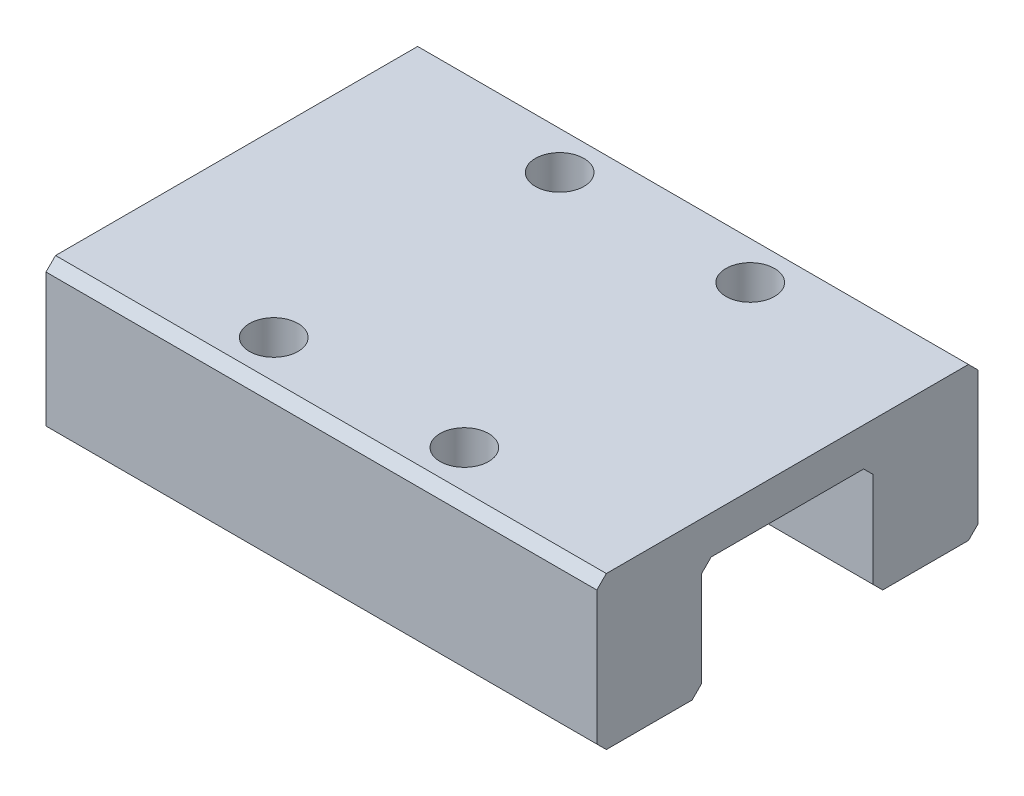
ISO-10303-21;
HEADER;
FILE_DESCRIPTION(('STEP AP214'),'2;1');
FILE_NAME('part.step','',(''),(''),'','','');
FILE_SCHEMA(('AUTOMOTIVE_DESIGN { 1 0 10303 214 1 1 1 1 }'));
ENDSEC;
DATA;
#1=APPLICATION_CONTEXT('core data for automotive mechanical design processes');
#2=APPLICATION_PROTOCOL_DEFINITION('international standard','automotive_design',2000,#1);
#3=PRODUCT_CONTEXT('',#1,'mechanical');
#4=PRODUCT('Part','Part','',(#3));
#5=PRODUCT_RELATED_PRODUCT_CATEGORY('part','',(#4));
#6=PRODUCT_DEFINITION_FORMATION('','',#4);
#7=PRODUCT_DEFINITION_CONTEXT('part definition',#1,'design');
#8=PRODUCT_DEFINITION('design','',#6,#7);
#9=PRODUCT_DEFINITION_SHAPE('','',#8);
#10=(LENGTH_UNIT() NAMED_UNIT(*) SI_UNIT(.MILLI.,.METRE.));
#11=(NAMED_UNIT(*) PLANE_ANGLE_UNIT() SI_UNIT($,.RADIAN.));
#12=(NAMED_UNIT(*) SI_UNIT($,.STERADIAN.) SOLID_ANGLE_UNIT());
#13=UNCERTAINTY_MEASURE_WITH_UNIT(LENGTH_MEASURE(1.E-05),#10,'distance_accuracy_value','');
#14=(GEOMETRIC_REPRESENTATION_CONTEXT(3) GLOBAL_UNCERTAINTY_ASSIGNED_CONTEXT((#13)) GLOBAL_UNIT_ASSIGNED_CONTEXT((#10,
#11,#12)) REPRESENTATION_CONTEXT('',''));
#15=CARTESIAN_POINT('',(0.,0.,0.));
#16=DIRECTION('',(0.,0.,1.));
#17=DIRECTION('',(1.,0.,0.));
#18=AXIS2_PLACEMENT_3D('',#15,#16,#17);
#19=CARTESIAN_POINT('',(28.9,-5.99999999999997,4.50000000000001));
#20=DIRECTION('',(0.,1.,0.));
#21=DIRECTION('',(0.,0.,1.));
#22=AXIS2_PLACEMENT_3D('',#19,#20,#21);
#23=PLANE('',#22);
#24=DIRECTION('',(0.,0.,-1.));
#25=VECTOR('',#24,1.);
#26=CARTESIAN_POINT('',(28.9,-5.99999999999997,4.50000000000001));
#27=LINE('',#26,#25);
#28=CARTESIAN_POINT('',(28.9,-5.99999999999998,9.50000000000001));
#29=VERTEX_POINT('',#28);
#30=CARTESIAN_POINT('',(28.9,-5.99999999999997,5.00000000000001));
#31=VERTEX_POINT('',#30);
#32=EDGE_CURVE('E217',#29,#31,#27,.T.);
#33=ORIENTED_EDGE('',*,*,#32,.F.);
#34=DIRECTION('',(-1.,0.,0.));
#35=VECTOR('',#34,1.);
#36=CARTESIAN_POINT('',(28.9,-5.99999999999998,9.50000000000001));
#37=LINE('',#36,#35);
#38=CARTESIAN_POINT('',(0.,-5.99999999999998,9.50000000000001));
#39=VERTEX_POINT('',#38);
#40=EDGE_CURVE('E278',#29,#39,#37,.T.);
#41=ORIENTED_EDGE('',*,*,#40,.T.);
#42=DIRECTION('',(0.,0.,-1.));
#43=VECTOR('',#42,1.);
#44=CARTESIAN_POINT('',(0.,-5.99999999999997,4.50000000000001));
#45=LINE('',#44,#43);
#46=CARTESIAN_POINT('',(0.,-5.99999999999997,5.00000000000001));
#47=VERTEX_POINT('',#46);
#48=EDGE_CURVE('E199',#39,#47,#45,.T.);
#49=ORIENTED_EDGE('',*,*,#48,.T.);
#50=DIRECTION('',(1.,0.,0.));
#51=VECTOR('',#50,1.);
#52=CARTESIAN_POINT('',(28.9,-5.99999999999997,5.00000000000001));
#53=LINE('',#52,#51);
#54=EDGE_CURVE('E275',#47,#31,#53,.T.);
#55=ORIENTED_EDGE('',*,*,#54,.T.);
#56=EDGE_LOOP('',(#33,#41,#49,#55));
#57=FACE_BOUND('',#56,.T.);
#58=ADVANCED_FACE('F46',(#57),#23,.F.);
#59=CARTESIAN_POINT('',(28.9,0.,4.50000000000001));
#60=DIRECTION('',(0.,0.,1.));
#61=DIRECTION('',(1.,0.,0.));
#62=AXIS2_PLACEMENT_3D('',#59,#60,#61);
#63=PLANE('',#62);
#64=DIRECTION('',(0.,1.,0.));
#65=VECTOR('',#64,1.);
#66=CARTESIAN_POINT('',(0.,0.,4.50000000000001));
#67=LINE('',#66,#65);
#68=CARTESIAN_POINT('',(0.,-5.49999999999997,4.50000000000001));
#69=VERTEX_POINT('',#68);
#70=CARTESIAN_POINT('',(0.,-0.499999999999971,4.50000000000001));
#71=VERTEX_POINT('',#70);
#72=EDGE_CURVE('E192',#69,#71,#67,.T.);
#73=ORIENTED_EDGE('',*,*,#72,.T.);
#74=DIRECTION('',(1.,0.,0.));
#75=VECTOR('',#74,1.);
#76=CARTESIAN_POINT('',(28.9,-0.499999999999971,4.50000000000001));
#77=LINE('',#76,#75);
#78=CARTESIAN_POINT('',(28.9,-0.499999999999971,4.50000000000001));
#79=VERTEX_POINT('',#78);
#80=EDGE_CURVE('E166',#71,#79,#77,.T.);
#81=ORIENTED_EDGE('',*,*,#80,.T.);
#82=DIRECTION('',(0.,1.,0.));
#83=VECTOR('',#82,1.);
#84=CARTESIAN_POINT('',(28.9,0.,4.50000000000001));
#85=LINE('',#84,#83);
#86=CARTESIAN_POINT('',(28.9,-5.49999999999997,4.50000000000001));
#87=VERTEX_POINT('',#86);
#88=EDGE_CURVE('E322',#87,#79,#85,.T.);
#89=ORIENTED_EDGE('',*,*,#88,.F.);
#90=DIRECTION('',(-1.,0.,0.));
#91=VECTOR('',#90,1.);
#92=CARTESIAN_POINT('',(28.9,-5.49999999999997,4.50000000000001));
#93=LINE('',#92,#91);
#94=EDGE_CURVE('E184',#87,#69,#93,.T.);
#95=ORIENTED_EDGE('',*,*,#94,.T.);
#96=EDGE_LOOP('',(#73,#81,#89,#95));
#97=FACE_BOUND('',#96,.T.);
#98=ADVANCED_FACE('F428',(#97),#63,.F.);
#99=CARTESIAN_POINT('',(28.9,0.,4.50000000000001));
#100=DIRECTION('',(0.,1.,0.));
#101=DIRECTION('',(0.,0.,1.));
#102=AXIS2_PLACEMENT_3D('',#99,#100,#101);
#103=PLANE('',#102);
#104=DIRECTION('',(0.,0.,-1.));
#105=VECTOR('',#104,1.);
#106=CARTESIAN_POINT('',(28.9,0.,4.50000000000001));
#107=LINE('',#106,#105);
#108=CARTESIAN_POINT('',(28.9,0.,4.00000000000001));
#109=VERTEX_POINT('',#108);
#110=CARTESIAN_POINT('',(28.9,0.,-4.00000000000001));
#111=VERTEX_POINT('',#110);
#112=EDGE_CURVE('E182',#109,#111,#107,.T.);
#113=ORIENTED_EDGE('',*,*,#112,.F.);
#114=DIRECTION('',(-1.,0.,0.));
#115=VECTOR('',#114,1.);
#116=CARTESIAN_POINT('',(0.,0.,4.00000000000001));
#117=LINE('',#116,#115);
#118=CARTESIAN_POINT('',(0.,0.,4.00000000000001));
#119=VERTEX_POINT('',#118);
#120=EDGE_CURVE('E165',#109,#119,#117,.T.);
#121=ORIENTED_EDGE('',*,*,#120,.T.);
#122=DIRECTION('',(0.,0.,-1.));
#123=VECTOR('',#122,1.);
#124=CARTESIAN_POINT('',(0.,0.,4.50000000000001));
#125=LINE('',#124,#123);
#126=CARTESIAN_POINT('',(0.,0.,-4.00000000000001));
#127=VERTEX_POINT('',#126);
#128=EDGE_CURVE('E179',#119,#127,#125,.T.);
#129=ORIENTED_EDGE('',*,*,#128,.T.);
#130=DIRECTION('',(1.,0.,0.));
#131=VECTOR('',#130,1.);
#132=CARTESIAN_POINT('',(28.9,0.,-4.00000000000001));
#133=LINE('',#132,#131);
#134=EDGE_CURVE('E185',#127,#111,#133,.T.);
#135=ORIENTED_EDGE('',*,*,#134,.T.);
#136=EDGE_LOOP('',(#113,#121,#129,#135));
#137=FACE_BOUND('',#136,.T.);
#138=ADVANCED_FACE('F178',(#137),#103,.F.);
#139=CARTESIAN_POINT('',(28.9,0.,-4.50000000000001));
#140=DIRECTION('',(0.,0.,-1.));
#141=DIRECTION('',(-1.,0.,0.));
#142=AXIS2_PLACEMENT_3D('',#139,#140,#141);
#143=PLANE('',#142);
#144=DIRECTION('',(0.,-1.,0.));
#145=VECTOR('',#144,1.);
#146=CARTESIAN_POINT('',(0.,0.,-4.50000000000001));
#147=LINE('',#146,#145);
#148=CARTESIAN_POINT('',(0.,-0.500000000000006,-4.50000000000001));
#149=VERTEX_POINT('',#148);
#150=CARTESIAN_POINT('',(0.,-5.5,-4.50000000000001));
#151=VERTEX_POINT('',#150);
#152=EDGE_CURVE('E191',#149,#151,#147,.T.);
#153=ORIENTED_EDGE('',*,*,#152,.T.);
#154=DIRECTION('',(1.,0.,0.));
#155=VECTOR('',#154,1.);
#156=CARTESIAN_POINT('',(28.9,-5.5,-4.50000000000001));
#157=LINE('',#156,#155);
#158=CARTESIAN_POINT('',(28.9,-5.5,-4.50000000000001));
#159=VERTEX_POINT('',#158);
#160=EDGE_CURVE('E255',#151,#159,#157,.T.);
#161=ORIENTED_EDGE('',*,*,#160,.T.);
#162=DIRECTION('',(0.,-1.,0.));
#163=VECTOR('',#162,1.);
#164=CARTESIAN_POINT('',(28.9,0.,-4.50000000000001));
#165=LINE('',#164,#163);
#166=CARTESIAN_POINT('',(28.9,-0.500000000000006,-4.50000000000001));
#167=VERTEX_POINT('',#166);
#168=EDGE_CURVE('E316',#167,#159,#165,.T.);
#169=ORIENTED_EDGE('',*,*,#168,.F.);
#170=DIRECTION('',(-1.,0.,0.));
#171=VECTOR('',#170,1.);
#172=CARTESIAN_POINT('',(0.,-0.500000000000006,-4.50000000000001));
#173=LINE('',#172,#171);
#174=EDGE_CURVE('E251',#167,#149,#173,.T.);
#175=ORIENTED_EDGE('',*,*,#174,.T.);
#176=EDGE_LOOP('',(#153,#161,#169,#175));
#177=FACE_BOUND('',#176,.T.);
#178=ADVANCED_FACE('F418',(#177),#143,.F.);
#179=CARTESIAN_POINT('',(28.9,-6.,-4.50000000000001));
#180=DIRECTION('',(0.,1.,0.));
#181=DIRECTION('',(0.,0.,1.));
#182=AXIS2_PLACEMENT_3D('',#179,#180,#181);
#183=PLANE('',#182);
#184=DIRECTION('',(0.,0.,-1.));
#185=VECTOR('',#184,1.);
#186=CARTESIAN_POINT('',(28.9,-6.,-4.50000000000001));
#187=LINE('',#186,#185);
#188=CARTESIAN_POINT('',(28.9,-6.,-5.));
#189=VERTEX_POINT('',#188);
#190=CARTESIAN_POINT('',(28.9,-6.,-9.50000000000001));
#191=VERTEX_POINT('',#190);
#192=EDGE_CURVE('E312',#189,#191,#187,.T.);
#193=ORIENTED_EDGE('',*,*,#192,.F.);
#194=DIRECTION('',(-1.,0.,0.));
#195=VECTOR('',#194,1.);
#196=CARTESIAN_POINT('',(28.9,-6.,-5.));
#197=LINE('',#196,#195);
#198=CARTESIAN_POINT('',(0.,-6.,-5.));
#199=VERTEX_POINT('',#198);
#200=EDGE_CURVE('E229',#189,#199,#197,.T.);
#201=ORIENTED_EDGE('',*,*,#200,.T.);
#202=DIRECTION('',(0.,0.,-1.));
#203=VECTOR('',#202,1.);
#204=CARTESIAN_POINT('',(0.,-6.,-4.50000000000001));
#205=LINE('',#204,#203);
#206=CARTESIAN_POINT('',(0.,-6.,-9.50000000000001));
#207=VERTEX_POINT('',#206);
#208=EDGE_CURVE('E197',#199,#207,#205,.T.);
#209=ORIENTED_EDGE('',*,*,#208,.T.);
#210=DIRECTION('',(1.,0.,0.));
#211=VECTOR('',#210,1.);
#212=CARTESIAN_POINT('',(28.9,-6.,-9.50000000000001));
#213=LINE('',#212,#211);
#214=EDGE_CURVE('E226',#207,#191,#213,.T.);
#215=ORIENTED_EDGE('',*,*,#214,.T.);
#216=EDGE_LOOP('',(#193,#201,#209,#215));
#217=FACE_BOUND('',#216,.T.);
#218=ADVANCED_FACE('F411',(#217),#183,.F.);
#219=CARTESIAN_POINT('',(28.9,-6.00000000000001,-10.));
#220=DIRECTION('',(0.,0.,1.));
#221=DIRECTION('',(1.,0.,0.));
#222=AXIS2_PLACEMENT_3D('',#219,#220,#221);
#223=PLANE('',#222);
#224=DIRECTION('',(0.,1.,0.));
#225=VECTOR('',#224,1.);
#226=CARTESIAN_POINT('',(28.9,-6.00000000000001,-10.));
#227=LINE('',#226,#225);
#228=CARTESIAN_POINT('',(28.9,-5.50000000000001,-10.));
#229=VERTEX_POINT('',#228);
#230=CARTESIAN_POINT('',(28.9,1.49999999999999,-10.));
#231=VERTEX_POINT('',#230);
#232=EDGE_CURVE('E308',#229,#231,#227,.T.);
#233=ORIENTED_EDGE('',*,*,#232,.F.);
#234=DIRECTION('',(-1.,0.,0.));
#235=VECTOR('',#234,1.);
#236=CARTESIAN_POINT('',(28.9,-5.50000000000001,-10.));
#237=LINE('',#236,#235);
#238=CARTESIAN_POINT('',(0.,-5.50000000000001,-10.));
#239=VERTEX_POINT('',#238);
#240=EDGE_CURVE('E291',#229,#239,#237,.T.);
#241=ORIENTED_EDGE('',*,*,#240,.T.);
#242=DIRECTION('',(0.,1.,0.));
#243=VECTOR('',#242,1.);
#244=CARTESIAN_POINT('',(0.,-6.00000000000001,-10.));
#245=LINE('',#244,#243);
#246=CARTESIAN_POINT('',(0.,1.49999999999999,-10.));
#247=VERTEX_POINT('',#246);
#248=EDGE_CURVE('E206',#239,#247,#245,.T.);
#249=ORIENTED_EDGE('',*,*,#248,.T.);
#250=DIRECTION('',(1.,0.,0.));
#251=VECTOR('',#250,1.);
#252=CARTESIAN_POINT('',(28.9,1.49999999999999,-10.));
#253=LINE('',#252,#251);
#254=EDGE_CURVE('E288',#247,#231,#253,.T.);
#255=ORIENTED_EDGE('',*,*,#254,.T.);
#256=EDGE_LOOP('',(#233,#241,#249,#255));
#257=FACE_BOUND('',#256,.T.);
#258=ADVANCED_FACE('F385',(#257),#223,.F.);
#259=CARTESIAN_POINT('',(28.9,2.,-10.));
#260=DIRECTION('',(0.,-1.,0.));
#261=DIRECTION('',(0.,0.,-1.));
#262=AXIS2_PLACEMENT_3D('',#259,#260,#261);
#263=PLANE('',#262);
#264=CARTESIAN_POINT('',(9.45,2.00000000000002,7.5));
#265=DIRECTION('',(0.,1.,0.));
#266=DIRECTION('',(0.,0.,-1.));
#267=AXIS2_PLACEMENT_3D('',#264,#265,#266);
#268=CIRCLE('',#267,1.275);
#269=CARTESIAN_POINT('',(9.45,2.00000000000002,6.225));
#270=VERTEX_POINT('',#269);
#271=EDGE_CURVE('E364',#270,#270,#268,.T.);
#272=ORIENTED_EDGE('',*,*,#271,.F.);
#273=EDGE_LOOP('',(#272));
#274=FACE_BOUND('',#273,.T.);
#275=CARTESIAN_POINT('',(19.45,2.00000000000002,7.5));
#276=DIRECTION('',(0.,1.,0.));
#277=DIRECTION('',(0.,0.,1.));
#278=AXIS2_PLACEMENT_3D('',#275,#276,#277);
#279=CIRCLE('',#278,1.275);
#280=CARTESIAN_POINT('',(19.45,2.00000000000002,8.775));
#281=VERTEX_POINT('',#280);
#282=EDGE_CURVE('E356',#281,#281,#279,.T.);
#283=ORIENTED_EDGE('',*,*,#282,.F.);
#284=EDGE_LOOP('',(#283));
#285=FACE_BOUND('',#284,.T.);
#286=CARTESIAN_POINT('',(19.45,2.,-7.5));
#287=DIRECTION('',(0.,1.,0.));
#288=DIRECTION('',(0.,0.,-1.));
#289=AXIS2_PLACEMENT_3D('',#286,#287,#288);
#290=CIRCLE('',#289,1.275);
#291=CARTESIAN_POINT('',(19.45,2.,-8.775));
#292=VERTEX_POINT('',#291);
#293=EDGE_CURVE('E348',#292,#292,#290,.T.);
#294=ORIENTED_EDGE('',*,*,#293,.F.);
#295=EDGE_LOOP('',(#294));
#296=FACE_BOUND('',#295,.T.);
#297=CARTESIAN_POINT('',(9.45,2.,-7.5));
#298=DIRECTION('',(0.,1.,0.));
#299=DIRECTION('',(0.,0.,1.));
#300=AXIS2_PLACEMENT_3D('',#297,#298,#299);
#301=CIRCLE('',#300,1.275);
#302=CARTESIAN_POINT('',(9.45,2.,-6.225));
#303=VERTEX_POINT('',#302);
#304=EDGE_CURVE('E332',#303,#303,#301,.T.);
#305=ORIENTED_EDGE('',*,*,#304,.F.);
#306=EDGE_LOOP('',(#305));
#307=FACE_BOUND('',#306,.T.);
#308=DIRECTION('',(0.,0.,1.));
#309=VECTOR('',#308,1.);
#310=CARTESIAN_POINT('',(28.9,2.,-10.));
#311=LINE('',#310,#309);
#312=CARTESIAN_POINT('',(28.9,2.,-9.50000000000001));
#313=VERTEX_POINT('',#312);
#314=CARTESIAN_POINT('',(28.9,2.00000000000002,9.5));
#315=VERTEX_POINT('',#314);
#316=EDGE_CURVE('E305',#313,#315,#311,.T.);
#317=ORIENTED_EDGE('',*,*,#316,.F.);
#318=DIRECTION('',(-1.,0.,0.));
#319=VECTOR('',#318,1.);
#320=CARTESIAN_POINT('',(28.9,2.,-9.50000000000001));
#321=LINE('',#320,#319);
#322=CARTESIAN_POINT('',(0.,2.,-9.50000000000001));
#323=VERTEX_POINT('',#322);
#324=EDGE_CURVE('E173',#313,#323,#321,.T.);
#325=ORIENTED_EDGE('',*,*,#324,.T.);
#326=DIRECTION('',(0.,0.,1.));
#327=VECTOR('',#326,1.);
#328=CARTESIAN_POINT('',(0.,2.,-10.));
#329=LINE('',#328,#327);
#330=CARTESIAN_POINT('',(0.,2.00000000000002,9.5));
#331=VERTEX_POINT('',#330);
#332=EDGE_CURVE('E210',#323,#331,#329,.T.);
#333=ORIENTED_EDGE('',*,*,#332,.T.);
#334=DIRECTION('',(1.,0.,0.));
#335=VECTOR('',#334,1.);
#336=CARTESIAN_POINT('',(28.9,2.00000000000002,9.5));
#337=LINE('',#336,#335);
#338=EDGE_CURVE('E295',#331,#315,#337,.T.);
#339=ORIENTED_EDGE('',*,*,#338,.T.);
#340=EDGE_LOOP('',(#317,#325,#333,#339));
#341=FACE_BOUND('',#340,.T.);
#342=ADVANCED_FACE('F381',(#274,#285,#296,#307,#341),#263,.F.);
#343=CARTESIAN_POINT('',(28.9,-5.99999999999998,10.));
#344=DIRECTION('',(0.,0.,-1.));
#345=DIRECTION('',(-1.,0.,0.));
#346=AXIS2_PLACEMENT_3D('',#343,#344,#345);
#347=PLANE('',#346);
#348=DIRECTION('',(0.,-1.,0.));
#349=VECTOR('',#348,1.);
#350=CARTESIAN_POINT('',(0.,-5.99999999999998,10.));
#351=LINE('',#350,#349);
#352=CARTESIAN_POINT('',(0.,1.50000000000002,10.));
#353=VERTEX_POINT('',#352);
#354=CARTESIAN_POINT('',(0.,-5.49999999999998,10.));
#355=VERTEX_POINT('',#354);
#356=EDGE_CURVE('E214',#353,#355,#351,.T.);
#357=ORIENTED_EDGE('',*,*,#356,.T.);
#358=DIRECTION('',(1.,0.,0.));
#359=VECTOR('',#358,1.);
#360=CARTESIAN_POINT('',(28.9,-5.49999999999998,10.));
#361=LINE('',#360,#359);
#362=CARTESIAN_POINT('',(28.9,-5.49999999999998,10.));
#363=VERTEX_POINT('',#362);
#364=EDGE_CURVE('E62',#355,#363,#361,.T.);
#365=ORIENTED_EDGE('',*,*,#364,.T.);
#366=DIRECTION('',(0.,-1.,0.));
#367=VECTOR('',#366,1.);
#368=CARTESIAN_POINT('',(28.9,-5.99999999999998,10.));
#369=LINE('',#368,#367);
#370=CARTESIAN_POINT('',(28.9,1.50000000000002,10.));
#371=VERTEX_POINT('',#370);
#372=EDGE_CURVE('E219',#371,#363,#369,.T.);
#373=ORIENTED_EDGE('',*,*,#372,.F.);
#374=DIRECTION('',(-1.,0.,0.));
#375=VECTOR('',#374,1.);
#376=CARTESIAN_POINT('',(28.9,1.50000000000002,10.));
#377=LINE('',#376,#375);
#378=EDGE_CURVE('E282',#371,#353,#377,.T.);
#379=ORIENTED_EDGE('',*,*,#378,.T.);
#380=EDGE_LOOP('',(#357,#365,#373,#379));
#381=FACE_BOUND('',#380,.T.);
#382=ADVANCED_FACE('F384',(#381),#347,.F.);
#383=CARTESIAN_POINT('',(28.9,-5.99999999999998,10.));
#384=DIRECTION('',(-1.,0.,0.));
#385=DIRECTION('',(0.,0.,1.));
#386=AXIS2_PLACEMENT_3D('',#383,#384,#385);
#387=PLANE('',#386);
#388=ORIENTED_EDGE('',*,*,#168,.T.);
#389=DIRECTION('',(0.,0.707106781186551,0.707106781186544));
#390=VECTOR('',#389,1.);
#391=CARTESIAN_POINT('',(28.9,-6.,-5.));
#392=LINE('',#391,#390);
#393=EDGE_CURVE('E272',#159,#189,#392,.F.);
#394=ORIENTED_EDGE('',*,*,#393,.T.);
#395=ORIENTED_EDGE('',*,*,#192,.T.);
#396=DIRECTION('',(0.,-0.707106781186545,0.70710678118655));
#397=VECTOR('',#396,1.);
#398=CARTESIAN_POINT('',(28.9,-5.50000000000001,-10.));
#399=LINE('',#398,#397);
#400=EDGE_CURVE('E263',#191,#229,#399,.F.);
#401=ORIENTED_EDGE('',*,*,#400,.T.);
#402=ORIENTED_EDGE('',*,*,#232,.T.);
#403=DIRECTION('',(0.,-0.70710678118655,-0.707106781186545));
#404=VECTOR('',#403,1.);
#405=CARTESIAN_POINT('',(28.9,2.,-9.50000000000001));
#406=LINE('',#405,#404);
#407=EDGE_CURVE('E260',#231,#313,#406,.F.);
#408=ORIENTED_EDGE('',*,*,#407,.T.);
#409=ORIENTED_EDGE('',*,*,#316,.T.);
#410=DIRECTION('',(0.,0.707106781186542,-0.707106781186553));
#411=VECTOR('',#410,1.);
#412=CARTESIAN_POINT('',(28.9,1.50000000000002,10.));
#413=LINE('',#412,#411);
#414=EDGE_CURVE('E69',#315,#371,#413,.F.);
#415=ORIENTED_EDGE('',*,*,#414,.T.);
#416=ORIENTED_EDGE('',*,*,#372,.T.);
#417=DIRECTION('',(0.,0.70710678118655,0.707106781186545));
#418=VECTOR('',#417,1.);
#419=CARTESIAN_POINT('',(28.9,-5.99999999999998,9.50000000000001));
#420=LINE('',#419,#418);
#421=EDGE_CURVE('E269',#363,#29,#420,.F.);
#422=ORIENTED_EDGE('',*,*,#421,.T.);
#423=ORIENTED_EDGE('',*,*,#32,.T.);
#424=DIRECTION('',(0.,-0.707106781186548,0.707106781186548));
#425=VECTOR('',#424,1.);
#426=CARTESIAN_POINT('',(28.9,-5.49999999999997,4.50000000000001));
#427=LINE('',#426,#425);
#428=EDGE_CURVE('E266',#31,#87,#427,.F.);
#429=ORIENTED_EDGE('',*,*,#428,.T.);
#430=ORIENTED_EDGE('',*,*,#88,.T.);
#431=DIRECTION('',(0.,-0.707106781186545,0.70710678118655));
#432=VECTOR('',#431,1.);
#433=CARTESIAN_POINT('',(28.9,-5.99999999999996,10.));
#434=LINE('',#433,#432);
#435=EDGE_CURVE('E172',#79,#109,#434,.F.);
#436=ORIENTED_EDGE('',*,*,#435,.T.);
#437=ORIENTED_EDGE('',*,*,#112,.T.);
#438=DIRECTION('',(0.,0.707106781186552,0.707106781186543));
#439=VECTOR('',#438,1.);
#440=CARTESIAN_POINT('',(28.9,3.99999999999998,0.));
#441=LINE('',#440,#439);
#442=EDGE_CURVE('E11',#111,#167,#441,.F.);
#443=ORIENTED_EDGE('',*,*,#442,.T.);
#444=EDGE_LOOP('',(#388,#394,#395,#401,#402,#408,#409,#415,#416,#422,#423,#429,#430,#436,#437,#443));
#445=FACE_BOUND('',#444,.T.);
#446=ADVANCED_FACE('F424',(#445),#387,.F.);
#447=CARTESIAN_POINT('',(0.,-5.99999999999998,10.));
#448=DIRECTION('',(-1.,0.,0.));
#449=DIRECTION('',(0.,0.,1.));
#450=AXIS2_PLACEMENT_3D('',#447,#448,#449);
#451=PLANE('',#450);
#452=ORIENTED_EDGE('',*,*,#208,.F.);
#453=DIRECTION('',(0.,-0.707106781186551,-0.707106781186544));
#454=VECTOR('',#453,1.);
#455=CARTESIAN_POINT('',(0.,1.50000000000002,2.49999999999995));
#456=LINE('',#455,#454);
#457=EDGE_CURVE('E248',#199,#151,#456,.F.);
#458=ORIENTED_EDGE('',*,*,#457,.T.);
#459=ORIENTED_EDGE('',*,*,#152,.F.);
#460=DIRECTION('',(0.,-0.707106781186552,-0.707106781186543));
#461=VECTOR('',#460,1.);
#462=CARTESIAN_POINT('',(0.,-0.500000000000006,-4.50000000000001));
#463=LINE('',#462,#461);
#464=EDGE_CURVE('E55',#149,#127,#463,.F.);
#465=ORIENTED_EDGE('',*,*,#464,.T.);
#466=ORIENTED_EDGE('',*,*,#128,.F.);
#467=DIRECTION('',(0.,0.707106781186545,-0.70710678118655));
#468=VECTOR('',#467,1.);
#469=CARTESIAN_POINT('',(0.,0.,4.00000000000001));
#470=LINE('',#469,#468);
#471=EDGE_CURVE('E161',#119,#71,#470,.F.);
#472=ORIENTED_EDGE('',*,*,#471,.T.);
#473=ORIENTED_EDGE('',*,*,#72,.F.);
#474=DIRECTION('',(0.,0.707106781186548,-0.707106781186548));
#475=VECTOR('',#474,1.);
#476=CARTESIAN_POINT('',(0.,-8.49999999999998,7.50000000000001));
#477=LINE('',#476,#475);
#478=EDGE_CURVE('E242',#69,#47,#477,.F.);
#479=ORIENTED_EDGE('',*,*,#478,.T.);
#480=ORIENTED_EDGE('',*,*,#48,.F.);
#481=DIRECTION('',(0.,-0.70710678118655,-0.707106781186545));
#482=VECTOR('',#481,1.);
#483=CARTESIAN_POINT('',(0.,-5.74999999999998,9.75000000000001));
#484=LINE('',#483,#482);
#485=EDGE_CURVE('E245',#39,#355,#484,.F.);
#486=ORIENTED_EDGE('',*,*,#485,.T.);
#487=ORIENTED_EDGE('',*,*,#356,.F.);
#488=DIRECTION('',(0.,-0.707106781186542,0.707106781186553));
#489=VECTOR('',#488,1.);
#490=CARTESIAN_POINT('',(0.,-2.24999999999992,13.75));
#491=LINE('',#490,#489);
#492=EDGE_CURVE('E233',#353,#331,#491,.F.);
#493=ORIENTED_EDGE('',*,*,#492,.T.);
#494=ORIENTED_EDGE('',*,*,#332,.F.);
#495=DIRECTION('',(0.,0.70710678118655,0.707106781186545));
#496=VECTOR('',#495,1.);
#497=CARTESIAN_POINT('',(0.,7.74999999999999,-3.75000000000006));
#498=LINE('',#497,#496);
#499=EDGE_CURVE('E236',#323,#247,#498,.F.);
#500=ORIENTED_EDGE('',*,*,#499,.T.);
#501=ORIENTED_EDGE('',*,*,#248,.F.);
#502=DIRECTION('',(0.,0.707106781186545,-0.70710678118655));
#503=VECTOR('',#502,1.);
#504=CARTESIAN_POINT('',(0.,-15.75,0.250000000000054));
#505=LINE('',#504,#503);
#506=EDGE_CURVE('E239',#239,#207,#505,.F.);
#507=ORIENTED_EDGE('',*,*,#506,.T.);
#508=EDGE_LOOP('',(#452,#458,#459,#465,#466,#472,#473,#479,#480,#486,#487,#493,#494,#500,#501,#507));
#509=FACE_BOUND('',#508,.T.);
#510=ADVANCED_FACE('F188',(#509),#451,.T.);
#511=CARTESIAN_POINT('',(28.9,0.,4.00000000000001));
#512=DIRECTION('',(0.,-0.70710678118655,-0.707106781186545));
#513=DIRECTION('',(0.,0.707106781186545,-0.70710678118655));
#514=AXIS2_PLACEMENT_3D('',#511,#512,#513);
#515=PLANE('',#514);
#516=ORIENTED_EDGE('',*,*,#435,.F.);
#517=ORIENTED_EDGE('',*,*,#80,.F.);
#518=ORIENTED_EDGE('',*,*,#471,.F.);
#519=ORIENTED_EDGE('',*,*,#120,.F.);
#520=EDGE_LOOP('',(#516,#517,#518,#519));
#521=FACE_BOUND('',#520,.T.);
#522=ADVANCED_FACE('F164',(#521),#515,.T.);
#523=CARTESIAN_POINT('',(28.9,-6.,-5.));
#524=DIRECTION('',(0.,0.707106781186544,-0.707106781186551));
#525=DIRECTION('',(0.,0.707106781186551,0.707106781186544));
#526=AXIS2_PLACEMENT_3D('',#523,#524,#525);
#527=PLANE('',#526);
#528=ORIENTED_EDGE('',*,*,#393,.F.);
#529=ORIENTED_EDGE('',*,*,#160,.F.);
#530=ORIENTED_EDGE('',*,*,#457,.F.);
#531=ORIENTED_EDGE('',*,*,#200,.F.);
#532=EDGE_LOOP('',(#528,#529,#530,#531));
#533=FACE_BOUND('',#532,.T.);
#534=ADVANCED_FACE('F415',(#533),#527,.F.);
#535=CARTESIAN_POINT('',(28.9,-0.500000000000006,-4.50000000000001));
#536=DIRECTION('',(0.,-0.707106781186542,0.707106781186552));
#537=DIRECTION('',(0.,-0.707106781186552,-0.707106781186543));
#538=AXIS2_PLACEMENT_3D('',#535,#536,#537);
#539=PLANE('',#538);
#540=ORIENTED_EDGE('',*,*,#442,.F.);
#541=ORIENTED_EDGE('',*,*,#134,.F.);
#542=ORIENTED_EDGE('',*,*,#464,.F.);
#543=ORIENTED_EDGE('',*,*,#174,.F.);
#544=EDGE_LOOP('',(#540,#541,#542,#543));
#545=FACE_BOUND('',#544,.T.);
#546=ADVANCED_FACE('F423',(#545),#539,.T.);
#547=CARTESIAN_POINT('',(28.9,-5.99999999999998,9.50000000000001));
#548=DIRECTION('',(0.,0.707106781186545,-0.70710678118655));
#549=DIRECTION('',(0.,0.70710678118655,0.707106781186545));
#550=AXIS2_PLACEMENT_3D('',#547,#548,#549);
#551=PLANE('',#550);
#552=ORIENTED_EDGE('',*,*,#421,.F.);
#553=ORIENTED_EDGE('',*,*,#364,.F.);
#554=ORIENTED_EDGE('',*,*,#485,.F.);
#555=ORIENTED_EDGE('',*,*,#40,.F.);
#556=EDGE_LOOP('',(#552,#553,#554,#555));
#557=FACE_BOUND('',#556,.T.);
#558=ADVANCED_FACE('F436',(#557),#551,.F.);
#559=CARTESIAN_POINT('',(28.9,-5.49999999999997,4.50000000000001));
#560=DIRECTION('',(0.,0.707106781186547,0.707106781186547));
#561=DIRECTION('',(0.,-0.707106781186548,0.707106781186548));
#562=AXIS2_PLACEMENT_3D('',#559,#560,#561);
#563=PLANE('',#562);
#564=ORIENTED_EDGE('',*,*,#428,.F.);
#565=ORIENTED_EDGE('',*,*,#54,.F.);
#566=ORIENTED_EDGE('',*,*,#478,.F.);
#567=ORIENTED_EDGE('',*,*,#94,.F.);
#568=EDGE_LOOP('',(#564,#565,#566,#567));
#569=FACE_BOUND('',#568,.T.);
#570=ADVANCED_FACE('F430',(#569),#563,.F.);
#571=CARTESIAN_POINT('',(28.9,-5.50000000000001,-10.));
#572=DIRECTION('',(0.,0.70710678118655,0.707106781186545));
#573=DIRECTION('',(0.,-0.707106781186545,0.70710678118655));
#574=AXIS2_PLACEMENT_3D('',#571,#572,#573);
#575=PLANE('',#574);
#576=ORIENTED_EDGE('',*,*,#400,.F.);
#577=ORIENTED_EDGE('',*,*,#214,.F.);
#578=ORIENTED_EDGE('',*,*,#506,.F.);
#579=ORIENTED_EDGE('',*,*,#240,.F.);
#580=EDGE_LOOP('',(#576,#577,#578,#579));
#581=FACE_BOUND('',#580,.T.);
#582=ADVANCED_FACE('F407',(#581),#575,.F.);
#583=CARTESIAN_POINT('',(28.9,2.,-9.50000000000001));
#584=DIRECTION('',(0.,-0.707106781186545,0.70710678118655));
#585=DIRECTION('',(0.,-0.70710678118655,-0.707106781186545));
#586=AXIS2_PLACEMENT_3D('',#583,#584,#585);
#587=PLANE('',#586);
#588=ORIENTED_EDGE('',*,*,#407,.F.);
#589=ORIENTED_EDGE('',*,*,#254,.F.);
#590=ORIENTED_EDGE('',*,*,#499,.F.);
#591=ORIENTED_EDGE('',*,*,#324,.F.);
#592=EDGE_LOOP('',(#588,#589,#590,#591));
#593=FACE_BOUND('',#592,.T.);
#594=ADVANCED_FACE('F399',(#593),#587,.F.);
#595=CARTESIAN_POINT('',(28.9,1.50000000000002,10.));
#596=DIRECTION('',(0.,-0.707106781186553,-0.707106781186542));
#597=DIRECTION('',(0.,0.707106781186542,-0.707106781186553));
#598=AXIS2_PLACEMENT_3D('',#595,#596,#597);
#599=PLANE('',#598);
#600=ORIENTED_EDGE('',*,*,#414,.F.);
#601=ORIENTED_EDGE('',*,*,#338,.F.);
#602=ORIENTED_EDGE('',*,*,#492,.F.);
#603=ORIENTED_EDGE('',*,*,#378,.F.);
#604=EDGE_LOOP('',(#600,#601,#602,#603));
#605=FACE_BOUND('',#604,.T.);
#606=ADVANCED_FACE('F48',(#605),#599,.F.);
#607=CARTESIAN_POINT('',(9.45,-1.,-7.5));
#608=DIRECTION('',(0.,1.,0.));
#609=DIRECTION('',(0.,0.,1.));
#610=AXIS2_PLACEMENT_3D('',#607,#608,#609);
#611=CYLINDRICAL_SURFACE('',#610,1.275);
#612=CARTESIAN_POINT('',(9.45,-1.,-7.5));
#613=DIRECTION('',(0.,1.,0.));
#614=DIRECTION('',(0.,0.,1.));
#615=AXIS2_PLACEMENT_3D('',#612,#613,#614);
#616=CIRCLE('',#615,1.275);
#617=CARTESIAN_POINT('',(9.45,-1.,-6.225));
#618=VERTEX_POINT('',#617);
#619=EDGE_CURVE('E336',#618,#618,#616,.T.);
#620=ORIENTED_EDGE('',*,*,#619,.F.);
#621=EDGE_LOOP('',(#620));
#622=FACE_BOUND('',#621,.T.);
#623=ORIENTED_EDGE('',*,*,#304,.T.);
#624=EDGE_LOOP('',(#623));
#625=FACE_BOUND('',#624,.T.);
#626=ADVANCED_FACE('F459',(#622,#625),#611,.F.);
#627=CARTESIAN_POINT('',(9.45,-1.,-7.5));
#628=DIRECTION('',(0.,1.,0.));
#629=DIRECTION('',(0.,0.,1.));
#630=AXIS2_PLACEMENT_3D('',#627,#628,#629);
#631=PLANE('',#630);
#632=ORIENTED_EDGE('',*,*,#619,.T.);
#633=EDGE_LOOP('',(#632));
#634=FACE_BOUND('',#633,.T.);
#635=ADVANCED_FACE('F465',(#634),#631,.T.);
#636=CARTESIAN_POINT('',(19.45,-1.,-7.5));
#637=DIRECTION('',(0.,1.,0.));
#638=DIRECTION('',(0.,0.,1.));
#639=AXIS2_PLACEMENT_3D('',#636,#637,#638);
#640=CYLINDRICAL_SURFACE('',#639,1.275);
#641=CARTESIAN_POINT('',(19.45,-1.,-7.5));
#642=DIRECTION('',(0.,1.,0.));
#643=DIRECTION('',(0.,0.,-1.));
#644=AXIS2_PLACEMENT_3D('',#641,#642,#643);
#645=CIRCLE('',#644,1.275);
#646=CARTESIAN_POINT('',(19.45,-1.,-8.775));
#647=VERTEX_POINT('',#646);
#648=EDGE_CURVE('E346',#647,#647,#645,.T.);
#649=ORIENTED_EDGE('',*,*,#648,.F.);
#650=EDGE_LOOP('',(#649));
#651=FACE_BOUND('',#650,.T.);
#652=ORIENTED_EDGE('',*,*,#293,.T.);
#653=EDGE_LOOP('',(#652));
#654=FACE_BOUND('',#653,.T.);
#655=ADVANCED_FACE('F472',(#651,#654),#640,.F.);
#656=CARTESIAN_POINT('',(19.45,-1.,-7.5));
#657=DIRECTION('',(0.,-1.,0.));
#658=DIRECTION('',(0.,0.,-1.));
#659=AXIS2_PLACEMENT_3D('',#656,#657,#658);
#660=PLANE('',#659);
#661=ORIENTED_EDGE('',*,*,#648,.T.);
#662=EDGE_LOOP('',(#661));
#663=FACE_BOUND('',#662,.T.);
#664=ADVANCED_FACE('F578',(#663),#660,.F.);
#665=CARTESIAN_POINT('',(19.45,-0.99999999999998,7.5));
#666=DIRECTION('',(0.,1.,0.));
#667=DIRECTION('',(0.,0.,1.));
#668=AXIS2_PLACEMENT_3D('',#665,#666,#667);
#669=CYLINDRICAL_SURFACE('',#668,1.275);
#670=CARTESIAN_POINT('',(19.45,-0.99999999999998,7.5));
#671=DIRECTION('',(0.,1.,0.));
#672=DIRECTION('',(0.,0.,1.));
#673=AXIS2_PLACEMENT_3D('',#670,#671,#672);
#674=CIRCLE('',#673,1.275);
#675=CARTESIAN_POINT('',(19.45,-0.999999999999979,8.775));
#676=VERTEX_POINT('',#675);
#677=EDGE_CURVE('E352',#676,#676,#674,.T.);
#678=ORIENTED_EDGE('',*,*,#677,.F.);
#679=EDGE_LOOP('',(#678));
#680=FACE_BOUND('',#679,.T.);
#681=ORIENTED_EDGE('',*,*,#282,.T.);
#682=EDGE_LOOP('',(#681));
#683=FACE_BOUND('',#682,.T.);
#684=ADVANCED_FACE('F585',(#680,#683),#669,.F.);
#685=CARTESIAN_POINT('',(19.45,-0.99999999999998,7.5));
#686=DIRECTION('',(0.,1.,0.));
#687=DIRECTION('',(0.,0.,1.));
#688=AXIS2_PLACEMENT_3D('',#685,#686,#687);
#689=PLANE('',#688);
#690=ORIENTED_EDGE('',*,*,#677,.T.);
#691=EDGE_LOOP('',(#690));
#692=FACE_BOUND('',#691,.T.);
#693=ADVANCED_FACE('F377',(#692),#689,.T.);
#694=CARTESIAN_POINT('',(9.45,-0.99999999999998,7.5));
#695=DIRECTION('',(0.,1.,0.));
#696=DIRECTION('',(0.,0.,1.));
#697=AXIS2_PLACEMENT_3D('',#694,#695,#696);
#698=CYLINDRICAL_SURFACE('',#697,1.275);
#699=CARTESIAN_POINT('',(9.45,-0.99999999999998,7.5));
#700=DIRECTION('',(0.,1.,0.));
#701=DIRECTION('',(0.,0.,-1.));
#702=AXIS2_PLACEMENT_3D('',#699,#700,#701);
#703=CIRCLE('',#702,1.275);
#704=CARTESIAN_POINT('',(9.45,-0.999999999999982,6.225));
#705=VERTEX_POINT('',#704);
#706=EDGE_CURVE('E360',#705,#705,#703,.T.);
#707=ORIENTED_EDGE('',*,*,#706,.F.);
#708=EDGE_LOOP('',(#707));
#709=FACE_BOUND('',#708,.T.);
#710=ORIENTED_EDGE('',*,*,#271,.T.);
#711=EDGE_LOOP('',(#710));
#712=FACE_BOUND('',#711,.T.);
#713=ADVANCED_FACE('F374',(#709,#712),#698,.F.);
#714=CARTESIAN_POINT('',(9.45,-0.99999999999998,7.5));
#715=DIRECTION('',(0.,-1.,0.));
#716=DIRECTION('',(0.,0.,-1.));
#717=AXIS2_PLACEMENT_3D('',#714,#715,#716);
#718=PLANE('',#717);
#719=ORIENTED_EDGE('',*,*,#706,.T.);
#720=EDGE_LOOP('',(#719));
#721=FACE_BOUND('',#720,.T.);
#722=ADVANCED_FACE('F372',(#721),#718,.F.);
#723=CLOSED_SHELL('',(#58,#98,#138,#178,#218,#258,#342,#382,#446,#510,#522,#534,#546,#558,#570,
#582,#594,#606,#626,#635,#655,#664,#684,#693,#713,#722));
#724=MANIFOLD_SOLID_BREP('B2',#723);
#725=ADVANCED_BREP_SHAPE_REPRESENTATION('',(#18,#724),#14);
#726=SHAPE_DEFINITION_REPRESENTATION(#9,#725);
ENDSEC;
END-ISO-10303-21;
